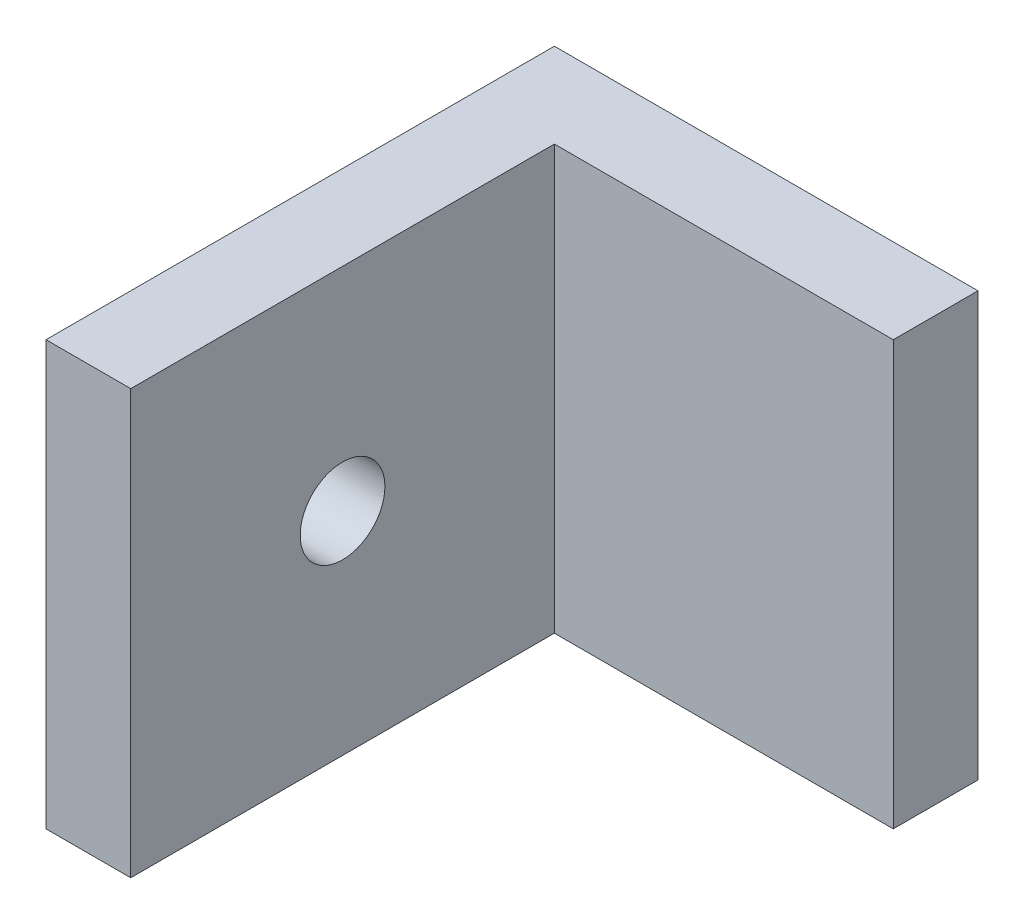
ISO-10303-21;
HEADER;
FILE_DESCRIPTION(('STEP AP214'),'2;1');
FILE_NAME('part.step','',(''),(''),'','','');
FILE_SCHEMA(('AUTOMOTIVE_DESIGN { 1 0 10303 214 1 1 1 1 }'));
ENDSEC;
DATA;
#1=APPLICATION_CONTEXT('core data for automotive mechanical design processes');
#2=APPLICATION_PROTOCOL_DEFINITION('international standard','automotive_design',2000,#1);
#3=PRODUCT_CONTEXT('',#1,'mechanical');
#4=PRODUCT('Part','Part','',(#3));
#5=PRODUCT_RELATED_PRODUCT_CATEGORY('part','',(#4));
#6=PRODUCT_DEFINITION_FORMATION('','',#4);
#7=PRODUCT_DEFINITION_CONTEXT('part definition',#1,'design');
#8=PRODUCT_DEFINITION('design','',#6,#7);
#9=PRODUCT_DEFINITION_SHAPE('','',#8);
#10=(LENGTH_UNIT() NAMED_UNIT(*) SI_UNIT(.MILLI.,.METRE.));
#11=(NAMED_UNIT(*) PLANE_ANGLE_UNIT() SI_UNIT($,.RADIAN.));
#12=(NAMED_UNIT(*) SI_UNIT($,.STERADIAN.) SOLID_ANGLE_UNIT());
#13=UNCERTAINTY_MEASURE_WITH_UNIT(LENGTH_MEASURE(1.E-05),#10,'distance_accuracy_value','');
#14=(GEOMETRIC_REPRESENTATION_CONTEXT(3) GLOBAL_UNCERTAINTY_ASSIGNED_CONTEXT((#13)) GLOBAL_UNIT_ASSIGNED_CONTEXT((#10,
#11,#12)) REPRESENTATION_CONTEXT('',''));
#15=CARTESIAN_POINT('',(0.,0.,0.));
#16=DIRECTION('',(0.,0.,1.));
#17=DIRECTION('',(1.,0.,0.));
#18=AXIS2_PLACEMENT_3D('',#15,#16,#17);
#19=CARTESIAN_POINT('',(-15.,-15.,6.));
#20=DIRECTION('',(1.,0.,0.));
#21=DIRECTION('',(0.,0.,-1.));
#22=AXIS2_PLACEMENT_3D('',#19,#20,#21);
#23=PLANE('',#22);
#24=CARTESIAN_POINT('',(-15.,0.,21.));
#25=DIRECTION('',(1.,0.,0.));
#26=DIRECTION('',(0.,0.,-1.));
#27=AXIS2_PLACEMENT_3D('',#24,#25,#26);
#28=CIRCLE('',#27,3.);
#29=CARTESIAN_POINT('',(-15.,0.,18.));
#30=VERTEX_POINT('',#29);
#31=EDGE_CURVE('E130',#30,#30,#28,.T.);
#32=ORIENTED_EDGE('',*,*,#31,.T.);
#33=EDGE_LOOP('',(#32));
#34=FACE_BOUND('',#33,.T.);
#35=DIRECTION('',(0.,-1.,0.));
#36=VECTOR('',#35,1.);
#37=CARTESIAN_POINT('',(-15.,-15.,0.));
#38=LINE('',#37,#36);
#39=CARTESIAN_POINT('',(-15.,15.,0.));
#40=VERTEX_POINT('',#39);
#41=CARTESIAN_POINT('',(-15.,-15.,0.));
#42=VERTEX_POINT('',#41);
#43=EDGE_CURVE('E93',#40,#42,#38,.T.);
#44=ORIENTED_EDGE('',*,*,#43,.T.);
#45=DIRECTION('',(0.,0.,-1.));
#46=VECTOR('',#45,1.);
#47=CARTESIAN_POINT('',(-15.,-15.,6.));
#48=LINE('',#47,#46);
#49=CARTESIAN_POINT('',(-15.,-15.,36.));
#50=VERTEX_POINT('',#49);
#51=EDGE_CURVE('E11',#50,#42,#48,.T.);
#52=ORIENTED_EDGE('',*,*,#51,.F.);
#53=DIRECTION('',(0.,-1.,0.));
#54=VECTOR('',#53,1.);
#55=CARTESIAN_POINT('',(-15.,15.,36.));
#56=LINE('',#55,#54);
#57=CARTESIAN_POINT('',(-15.,15.,36.));
#58=VERTEX_POINT('',#57);
#59=EDGE_CURVE('E95',#58,#50,#56,.T.);
#60=ORIENTED_EDGE('',*,*,#59,.F.);
#61=DIRECTION('',(0.,0.,-1.));
#62=VECTOR('',#61,1.);
#63=CARTESIAN_POINT('',(-15.,15.,6.));
#64=LINE('',#63,#62);
#65=EDGE_CURVE('E80',#58,#40,#64,.T.);
#66=ORIENTED_EDGE('',*,*,#65,.T.);
#67=EDGE_LOOP('',(#44,#52,#60,#66));
#68=FACE_BOUND('',#67,.T.);
#69=ADVANCED_FACE('F33',(#34,#68),#23,.F.);
#70=CARTESIAN_POINT('',(15.,-15.,6.));
#71=DIRECTION('',(0.,1.,0.));
#72=DIRECTION('',(-1.,0.,0.));
#73=AXIS2_PLACEMENT_3D('',#70,#71,#72);
#74=PLANE('',#73);
#75=DIRECTION('',(1.,0.,0.));
#76=VECTOR('',#75,1.);
#77=CARTESIAN_POINT('',(15.,-15.,0.));
#78=LINE('',#77,#76);
#79=CARTESIAN_POINT('',(15.,-15.,0.));
#80=VERTEX_POINT('',#79);
#81=EDGE_CURVE('E100',#42,#80,#78,.T.);
#82=ORIENTED_EDGE('',*,*,#81,.T.);
#83=DIRECTION('',(0.,0.,-1.));
#84=VECTOR('',#83,1.);
#85=CARTESIAN_POINT('',(15.,-15.,6.));
#86=LINE('',#85,#84);
#87=CARTESIAN_POINT('',(15.,-15.,6.));
#88=VERTEX_POINT('',#87);
#89=EDGE_CURVE('E41',#88,#80,#86,.T.);
#90=ORIENTED_EDGE('',*,*,#89,.F.);
#91=DIRECTION('',(1.,0.,0.));
#92=VECTOR('',#91,1.);
#93=CARTESIAN_POINT('',(15.,-15.,6.));
#94=LINE('',#93,#92);
#95=CARTESIAN_POINT('',(-9.,-15.,6.));
#96=VERTEX_POINT('',#95);
#97=EDGE_CURVE('E87',#96,#88,#94,.T.);
#98=ORIENTED_EDGE('',*,*,#97,.F.);
#99=DIRECTION('',(0.,0.,-1.));
#100=VECTOR('',#99,1.);
#101=CARTESIAN_POINT('',(-9.,-15.,36.));
#102=LINE('',#101,#100);
#103=CARTESIAN_POINT('',(-9.,-15.,36.));
#104=VERTEX_POINT('',#103);
#105=EDGE_CURVE('E101',#104,#96,#102,.T.);
#106=ORIENTED_EDGE('',*,*,#105,.F.);
#107=DIRECTION('',(1.,0.,0.));
#108=VECTOR('',#107,1.);
#109=CARTESIAN_POINT('',(-15.,-15.,36.));
#110=LINE('',#109,#108);
#111=EDGE_CURVE('E134',#50,#104,#110,.T.);
#112=ORIENTED_EDGE('',*,*,#111,.F.);
#113=ORIENTED_EDGE('',*,*,#51,.T.);
#114=EDGE_LOOP('',(#82,#90,#98,#106,#112,#113));
#115=FACE_BOUND('',#114,.T.);
#116=ADVANCED_FACE('F168',(#115),#74,.F.);
#117=CARTESIAN_POINT('',(15.,-15.,6.));
#118=DIRECTION('',(-1.,0.,0.));
#119=DIRECTION('',(0.,0.,1.));
#120=AXIS2_PLACEMENT_3D('',#117,#118,#119);
#121=PLANE('',#120);
#122=DIRECTION('',(0.,1.,0.));
#123=VECTOR('',#122,1.);
#124=CARTESIAN_POINT('',(15.,-15.,0.));
#125=LINE('',#124,#123);
#126=CARTESIAN_POINT('',(15.,15.,0.));
#127=VERTEX_POINT('',#126);
#128=EDGE_CURVE('E88',#80,#127,#125,.T.);
#129=ORIENTED_EDGE('',*,*,#128,.T.);
#130=DIRECTION('',(0.,0.,-1.));
#131=VECTOR('',#130,1.);
#132=CARTESIAN_POINT('',(15.,15.,6.));
#133=LINE('',#132,#131);
#134=CARTESIAN_POINT('',(15.,15.,6.));
#135=VERTEX_POINT('',#134);
#136=EDGE_CURVE('E83',#135,#127,#133,.T.);
#137=ORIENTED_EDGE('',*,*,#136,.F.);
#138=DIRECTION('',(0.,1.,0.));
#139=VECTOR('',#138,1.);
#140=CARTESIAN_POINT('',(15.,-15.,6.));
#141=LINE('',#140,#139);
#142=EDGE_CURVE('E55',#88,#135,#141,.T.);
#143=ORIENTED_EDGE('',*,*,#142,.F.);
#144=ORIENTED_EDGE('',*,*,#89,.T.);
#145=EDGE_LOOP('',(#129,#137,#143,#144));
#146=FACE_BOUND('',#145,.T.);
#147=ADVANCED_FACE('F173',(#146),#121,.F.);
#148=CARTESIAN_POINT('',(15.,15.,6.));
#149=DIRECTION('',(0.,-1.,0.));
#150=DIRECTION('',(1.,0.,0.));
#151=AXIS2_PLACEMENT_3D('',#148,#149,#150);
#152=PLANE('',#151);
#153=DIRECTION('',(-1.,0.,0.));
#154=VECTOR('',#153,1.);
#155=CARTESIAN_POINT('',(15.,15.,0.));
#156=LINE('',#155,#154);
#157=EDGE_CURVE('E75',#127,#40,#156,.T.);
#158=ORIENTED_EDGE('',*,*,#157,.T.);
#159=ORIENTED_EDGE('',*,*,#65,.F.);
#160=DIRECTION('',(-1.,0.,0.));
#161=VECTOR('',#160,1.);
#162=CARTESIAN_POINT('',(-15.,15.,36.));
#163=LINE('',#162,#161);
#164=CARTESIAN_POINT('',(-9.,15.,36.));
#165=VERTEX_POINT('',#164);
#166=EDGE_CURVE('E129',#165,#58,#163,.T.);
#167=ORIENTED_EDGE('',*,*,#166,.F.);
#168=DIRECTION('',(0.,0.,-1.));
#169=VECTOR('',#168,1.);
#170=CARTESIAN_POINT('',(-9.,15.,36.));
#171=LINE('',#170,#169);
#172=CARTESIAN_POINT('',(-9.,15.,6.));
#173=VERTEX_POINT('',#172);
#174=EDGE_CURVE('E105',#165,#173,#171,.T.);
#175=ORIENTED_EDGE('',*,*,#174,.T.);
#176=DIRECTION('',(-1.,0.,0.));
#177=VECTOR('',#176,1.);
#178=CARTESIAN_POINT('',(15.,15.,6.));
#179=LINE('',#178,#177);
#180=EDGE_CURVE('E97',#135,#173,#179,.T.);
#181=ORIENTED_EDGE('',*,*,#180,.F.);
#182=ORIENTED_EDGE('',*,*,#136,.T.);
#183=EDGE_LOOP('',(#158,#159,#167,#175,#181,#182));
#184=FACE_BOUND('',#183,.T.);
#185=ADVANCED_FACE('F77',(#184),#152,.F.);
#186=CARTESIAN_POINT('',(0.,0.,6.));
#187=DIRECTION('',(0.,0.,1.));
#188=DIRECTION('',(1.,0.,0.));
#189=AXIS2_PLACEMENT_3D('',#186,#187,#188);
#190=PLANE('',#189);
#191=DIRECTION('',(0.,1.,0.));
#192=VECTOR('',#191,1.);
#193=CARTESIAN_POINT('',(-9.,15.,6.));
#194=LINE('',#193,#192);
#195=EDGE_CURVE('E49',#96,#173,#194,.T.);
#196=ORIENTED_EDGE('',*,*,#195,.F.);
#197=ORIENTED_EDGE('',*,*,#97,.T.);
#198=ORIENTED_EDGE('',*,*,#142,.T.);
#199=ORIENTED_EDGE('',*,*,#180,.T.);
#200=EDGE_LOOP('',(#196,#197,#198,#199));
#201=FACE_BOUND('',#200,.T.);
#202=ADVANCED_FACE('F122',(#201),#190,.T.);
#203=CARTESIAN_POINT('',(0.,0.,0.));
#204=DIRECTION('',(0.,0.,1.));
#205=DIRECTION('',(1.,0.,0.));
#206=AXIS2_PLACEMENT_3D('',#203,#204,#205);
#207=PLANE('',#206);
#208=ORIENTED_EDGE('',*,*,#43,.F.);
#209=ORIENTED_EDGE('',*,*,#157,.F.);
#210=ORIENTED_EDGE('',*,*,#128,.F.);
#211=ORIENTED_EDGE('',*,*,#81,.F.);
#212=EDGE_LOOP('',(#208,#209,#210,#211));
#213=FACE_BOUND('',#212,.T.);
#214=ADVANCED_FACE('F99',(#213),#207,.F.);
#215=CARTESIAN_POINT('',(-9.,15.,36.));
#216=DIRECTION('',(-1.,0.,0.));
#217=DIRECTION('',(0.,0.,1.));
#218=AXIS2_PLACEMENT_3D('',#215,#216,#217);
#219=PLANE('',#218);
#220=CARTESIAN_POINT('',(-9.,0.,21.));
#221=DIRECTION('',(1.,0.,0.));
#222=DIRECTION('',(0.,0.,-1.));
#223=AXIS2_PLACEMENT_3D('',#220,#221,#222);
#224=CIRCLE('',#223,3.);
#225=CARTESIAN_POINT('',(-9.,0.,18.));
#226=VERTEX_POINT('',#225);
#227=EDGE_CURVE('E143',#226,#226,#224,.T.);
#228=ORIENTED_EDGE('',*,*,#227,.F.);
#229=EDGE_LOOP('',(#228));
#230=FACE_BOUND('',#229,.T.);
#231=ORIENTED_EDGE('',*,*,#195,.T.);
#232=ORIENTED_EDGE('',*,*,#174,.F.);
#233=DIRECTION('',(0.,1.,0.));
#234=VECTOR('',#233,1.);
#235=CARTESIAN_POINT('',(-9.,15.,36.));
#236=LINE('',#235,#234);
#237=EDGE_CURVE('E131',#104,#165,#236,.T.);
#238=ORIENTED_EDGE('',*,*,#237,.F.);
#239=ORIENTED_EDGE('',*,*,#105,.T.);
#240=EDGE_LOOP('',(#231,#232,#238,#239));
#241=FACE_BOUND('',#240,.T.);
#242=ADVANCED_FACE('F126',(#230,#241),#219,.F.);
#243=CARTESIAN_POINT('',(0.,0.,36.));
#244=DIRECTION('',(0.,0.,-1.));
#245=DIRECTION('',(-1.,0.,0.));
#246=AXIS2_PLACEMENT_3D('',#243,#244,#245);
#247=PLANE('',#246);
#248=ORIENTED_EDGE('',*,*,#166,.T.);
#249=ORIENTED_EDGE('',*,*,#59,.T.);
#250=ORIENTED_EDGE('',*,*,#111,.T.);
#251=ORIENTED_EDGE('',*,*,#237,.T.);
#252=EDGE_LOOP('',(#248,#249,#250,#251));
#253=FACE_BOUND('',#252,.T.);
#254=ADVANCED_FACE('F153',(#253),#247,.F.);
#255=CARTESIAN_POINT('',(-15.,0.,21.));
#256=DIRECTION('',(1.,0.,0.));
#257=DIRECTION('',(0.,0.,-1.));
#258=AXIS2_PLACEMENT_3D('',#255,#256,#257);
#259=CYLINDRICAL_SURFACE('',#258,3.);
#260=ORIENTED_EDGE('',*,*,#31,.F.);
#261=EDGE_LOOP('',(#260));
#262=FACE_BOUND('',#261,.T.);
#263=ORIENTED_EDGE('',*,*,#227,.T.);
#264=EDGE_LOOP('',(#263));
#265=FACE_BOUND('',#264,.T.);
#266=ADVANCED_FACE('F150',(#262,#265),#259,.F.);
#267=CLOSED_SHELL('',(#69,#116,#147,#185,#202,#214,#242,#254,#266));
#268=MANIFOLD_SOLID_BREP('B2',#267);
#269=ADVANCED_BREP_SHAPE_REPRESENTATION('',(#18,#268),#14);
#270=SHAPE_DEFINITION_REPRESENTATION(#9,#269);
ENDSEC;
END-ISO-10303-21;
